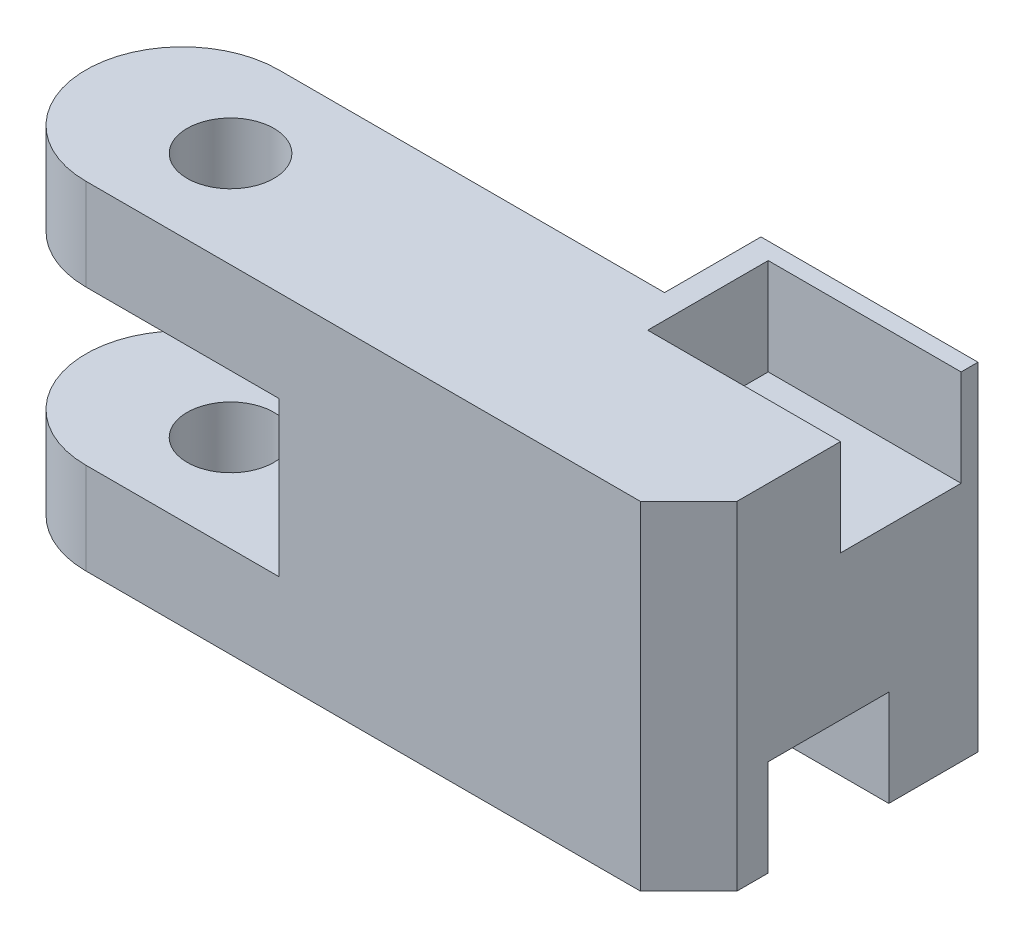
ISO-10303-21;
HEADER;
FILE_DESCRIPTION(('STEP AP214'),'2;1');
FILE_NAME('part.step','',(''),(''),'','','');
FILE_SCHEMA(('AUTOMOTIVE_DESIGN { 1 0 10303 214 1 1 1 1 }'));
ENDSEC;
DATA;
#1=APPLICATION_CONTEXT('core data for automotive mechanical design processes');
#2=APPLICATION_PROTOCOL_DEFINITION('international standard','automotive_design',2000,#1);
#3=PRODUCT_CONTEXT('',#1,'mechanical');
#4=PRODUCT('Part','Part','',(#3));
#5=PRODUCT_RELATED_PRODUCT_CATEGORY('part','',(#4));
#6=PRODUCT_DEFINITION_FORMATION('','',#4);
#7=PRODUCT_DEFINITION_CONTEXT('part definition',#1,'design');
#8=PRODUCT_DEFINITION('design','',#6,#7);
#9=PRODUCT_DEFINITION_SHAPE('','',#8);
#10=(LENGTH_UNIT() NAMED_UNIT(*) SI_UNIT(.MILLI.,.METRE.));
#11=(NAMED_UNIT(*) PLANE_ANGLE_UNIT() SI_UNIT($,.RADIAN.));
#12=(NAMED_UNIT(*) SI_UNIT($,.STERADIAN.) SOLID_ANGLE_UNIT());
#13=UNCERTAINTY_MEASURE_WITH_UNIT(LENGTH_MEASURE(1.E-05),#10,'distance_accuracy_value','');
#14=(GEOMETRIC_REPRESENTATION_CONTEXT(3) GLOBAL_UNCERTAINTY_ASSIGNED_CONTEXT((#13)) GLOBAL_UNIT_ASSIGNED_CONTEXT((#10,
#11,#12)) REPRESENTATION_CONTEXT('',''));
#15=CARTESIAN_POINT('',(0.,0.,0.));
#16=DIRECTION('',(0.,0.,1.));
#17=DIRECTION('',(1.,0.,0.));
#18=AXIS2_PLACEMENT_3D('',#15,#16,#17);
#19=CARTESIAN_POINT('',(-1.,7.,0.));
#20=DIRECTION('',(0.,-1.,0.));
#21=DIRECTION('',(0.,0.,-1.));
#22=AXIS2_PLACEMENT_3D('',#19,#20,#21);
#23=CYLINDRICAL_SURFACE('',#22,2.);
#24=DIRECTION('',(0.,-1.,0.));
#25=VECTOR('',#24,1.);
#26=CARTESIAN_POINT('',(-1.,7.,-2.));
#27=LINE('',#26,#25);
#28=CARTESIAN_POINT('',(-1.,7.,-2.));
#29=VERTEX_POINT('',#28);
#30=CARTESIAN_POINT('',(-0.999999999999999,5.1,-2.));
#31=VERTEX_POINT('',#30);
#32=EDGE_CURVE('E301',#29,#31,#27,.T.);
#33=ORIENTED_EDGE('',*,*,#32,.T.);
#34=CARTESIAN_POINT('',(-1.,5.1,0.));
#35=DIRECTION('',(0.,1.,0.));
#36=DIRECTION('',(-1.,0.,0.));
#37=AXIS2_PLACEMENT_3D('',#34,#35,#36);
#38=CIRCLE('',#37,2.);
#39=CARTESIAN_POINT('',(-1.,5.1,2.));
#40=VERTEX_POINT('',#39);
#41=EDGE_CURVE('E238',#40,#31,#38,.F.);
#42=ORIENTED_EDGE('',*,*,#41,.F.);
#43=DIRECTION('',(0.,-1.,0.));
#44=VECTOR('',#43,1.);
#45=CARTESIAN_POINT('',(-1.,7.,2.));
#46=LINE('',#45,#44);
#47=CARTESIAN_POINT('',(-1.,7.,2.));
#48=VERTEX_POINT('',#47);
#49=EDGE_CURVE('E314',#48,#40,#46,.T.);
#50=ORIENTED_EDGE('',*,*,#49,.F.);
#51=CARTESIAN_POINT('',(-1.,7.,0.));
#52=DIRECTION('',(0.,1.,0.));
#53=DIRECTION('',(0.,0.,1.));
#54=AXIS2_PLACEMENT_3D('',#51,#52,#53);
#55=CIRCLE('',#54,2.);
#56=EDGE_CURVE('E273',#29,#48,#55,.T.);
#57=ORIENTED_EDGE('',*,*,#56,.F.);
#58=EDGE_LOOP('',(#33,#42,#50,#57));
#59=FACE_BOUND('',#58,.T.);
#60=ADVANCED_FACE('F41',(#59),#23,.T.);
#61=CARTESIAN_POINT('',(0.,7.,0.));
#62=DIRECTION('',(0.,-1.,0.));
#63=DIRECTION('',(0.,0.,-1.));
#64=AXIS2_PLACEMENT_3D('',#61,#62,#63);
#65=CYLINDRICAL_SURFACE('',#64,0.9);
#66=CARTESIAN_POINT('',(0.,5.1,0.));
#67=DIRECTION('',(0.,1.,0.));
#68=DIRECTION('',(-1.,0.,0.));
#69=AXIS2_PLACEMENT_3D('',#66,#67,#68);
#70=CIRCLE('',#69,0.9);
#71=CARTESIAN_POINT('',(-0.9,5.1,0.));
#72=VERTEX_POINT('',#71);
#73=EDGE_CURVE('E242',#72,#72,#70,.F.);
#74=ORIENTED_EDGE('',*,*,#73,.T.);
#75=EDGE_LOOP('',(#74));
#76=FACE_BOUND('',#75,.T.);
#77=CARTESIAN_POINT('',(0.,7.,0.));
#78=DIRECTION('',(0.,1.,0.));
#79=DIRECTION('',(0.,0.,1.));
#80=AXIS2_PLACEMENT_3D('',#77,#78,#79);
#81=CIRCLE('',#80,0.9);
#82=CARTESIAN_POINT('',(0.,7.,0.9));
#83=VERTEX_POINT('',#82);
#84=EDGE_CURVE('E267',#83,#83,#81,.T.);
#85=ORIENTED_EDGE('',*,*,#84,.T.);
#86=EDGE_LOOP('',(#85));
#87=FACE_BOUND('',#86,.T.);
#88=ADVANCED_FACE('F379',(#76,#87),#65,.F.);
#89=CARTESIAN_POINT('',(-1.,7.,0.));
#90=DIRECTION('',(0.,1.,0.));
#91=DIRECTION('',(0.,0.,1.));
#92=AXIS2_PLACEMENT_3D('',#89,#90,#91);
#93=PLANE('',#92);
#94=DIRECTION('',(1.,0.,0.));
#95=VECTOR('',#94,1.);
#96=CARTESIAN_POINT('',(-1.,7.,2.));
#97=LINE('',#96,#95);
#98=CARTESIAN_POINT('',(10.5,7.,2.));
#99=VERTEX_POINT('',#98);
#100=EDGE_CURVE('E276',#48,#99,#97,.T.);
#101=ORIENTED_EDGE('',*,*,#100,.T.);
#102=DIRECTION('',(-0.707106781186549,0.,0.707106781186546));
#103=VECTOR('',#102,1.);
#104=CARTESIAN_POINT('',(5.74999999999997,7.,6.75));
#105=LINE('',#104,#103);
#106=CARTESIAN_POINT('',(11.5,7.,1.));
#107=VERTEX_POINT('',#106);
#108=EDGE_CURVE('E11',#99,#107,#105,.F.);
#109=ORIENTED_EDGE('',*,*,#108,.T.);
#110=DIRECTION('',(0.,0.,-1.));
#111=VECTOR('',#110,1.);
#112=CARTESIAN_POINT('',(11.5,7.,-2.));
#113=LINE('',#112,#111);
#114=CARTESIAN_POINT('',(11.5,7.,-1.15));
#115=VERTEX_POINT('',#114);
#116=EDGE_CURVE('E198',#107,#115,#113,.T.);
#117=ORIENTED_EDGE('',*,*,#116,.T.);
#118=DIRECTION('',(1.,0.,0.));
#119=VECTOR('',#118,1.);
#120=CARTESIAN_POINT('',(7.5,7.,-1.15));
#121=LINE('',#120,#119);
#122=CARTESIAN_POINT('',(7.5,7.,-1.15));
#123=VERTEX_POINT('',#122);
#124=EDGE_CURVE('E177',#123,#115,#121,.T.);
#125=ORIENTED_EDGE('',*,*,#124,.F.);
#126=DIRECTION('',(0.,0.,1.));
#127=VECTOR('',#126,1.);
#128=CARTESIAN_POINT('',(7.5,7.,-3.65));
#129=LINE('',#128,#127);
#130=CARTESIAN_POINT('',(7.5,7.,-3.65));
#131=VERTEX_POINT('',#130);
#132=EDGE_CURVE('E184',#131,#123,#129,.T.);
#133=ORIENTED_EDGE('',*,*,#132,.F.);
#134=DIRECTION('',(1.,0.,0.));
#135=VECTOR('',#134,1.);
#136=CARTESIAN_POINT('',(7.5,7.,-3.65));
#137=LINE('',#136,#135);
#138=CARTESIAN_POINT('',(11.5,7.,-3.65));
#139=VERTEX_POINT('',#138);
#140=EDGE_CURVE('E239',#131,#139,#137,.T.);
#141=ORIENTED_EDGE('',*,*,#140,.T.);
#142=CARTESIAN_POINT('',(11.5,7.,-4.));
#143=VERTEX_POINT('',#142);
#144=EDGE_CURVE('E279',#139,#143,#113,.T.);
#145=ORIENTED_EDGE('',*,*,#144,.T.);
#146=DIRECTION('',(-1.,0.,0.));
#147=VECTOR('',#146,1.);
#148=CARTESIAN_POINT('',(11.5,7.,-4.));
#149=LINE('',#148,#147);
#150=CARTESIAN_POINT('',(7.,7.,-4.));
#151=VERTEX_POINT('',#150);
#152=EDGE_CURVE('E281',#143,#151,#149,.T.);
#153=ORIENTED_EDGE('',*,*,#152,.T.);
#154=DIRECTION('',(0.,0.,1.));
#155=VECTOR('',#154,1.);
#156=CARTESIAN_POINT('',(7.,7.,-4.));
#157=LINE('',#156,#155);
#158=CARTESIAN_POINT('',(7.,7.,-2.));
#159=VERTEX_POINT('',#158);
#160=EDGE_CURVE('E283',#151,#159,#157,.T.);
#161=ORIENTED_EDGE('',*,*,#160,.T.);
#162=DIRECTION('',(-1.,0.,0.));
#163=VECTOR('',#162,1.);
#164=CARTESIAN_POINT('',(-1.,7.,-2.));
#165=LINE('',#164,#163);
#166=EDGE_CURVE('E285',#159,#29,#165,.T.);
#167=ORIENTED_EDGE('',*,*,#166,.T.);
#168=ORIENTED_EDGE('',*,*,#56,.T.);
#169=EDGE_LOOP('',(#101,#109,#117,#125,#133,#141,#145,#153,#161,#167,#168));
#170=FACE_BOUND('',#169,.T.);
#171=ORIENTED_EDGE('',*,*,#84,.F.);
#172=EDGE_LOOP('',(#171));
#173=FACE_BOUND('',#172,.T.);
#174=ADVANCED_FACE('F195',(#170,#173),#93,.T.);
#175=CARTESIAN_POINT('',(-1.,0.,0.));
#176=DIRECTION('',(0.,1.,0.));
#177=DIRECTION('',(0.,0.,1.));
#178=AXIS2_PLACEMENT_3D('',#175,#176,#177);
#179=PLANE('',#178);
#180=DIRECTION('',(0.,0.,-1.));
#181=VECTOR('',#180,1.);
#182=CARTESIAN_POINT('',(11.5,0.,-2.));
#183=LINE('',#182,#181);
#184=CARTESIAN_POINT('',(11.5,0.,1.));
#185=VERTEX_POINT('',#184);
#186=CARTESIAN_POINT('',(11.5,0.,0.35));
#187=VERTEX_POINT('',#186);
#188=EDGE_CURVE('E293',#185,#187,#183,.T.);
#189=ORIENTED_EDGE('',*,*,#188,.F.);
#190=DIRECTION('',(0.707106781186549,0.,-0.707106781186546));
#191=VECTOR('',#190,1.);
#192=CARTESIAN_POINT('',(11.5,0.,1.));
#193=LINE('',#192,#191);
#194=CARTESIAN_POINT('',(10.5,0.,2.));
#195=VERTEX_POINT('',#194);
#196=EDGE_CURVE('E64',#185,#195,#193,.F.);
#197=ORIENTED_EDGE('',*,*,#196,.T.);
#198=DIRECTION('',(1.,0.,0.));
#199=VECTOR('',#198,1.);
#200=CARTESIAN_POINT('',(-1.,0.,2.));
#201=LINE('',#200,#199);
#202=CARTESIAN_POINT('',(-1.,0.,2.));
#203=VERTEX_POINT('',#202);
#204=EDGE_CURVE('E290',#203,#195,#201,.T.);
#205=ORIENTED_EDGE('',*,*,#204,.F.);
#206=CARTESIAN_POINT('',(-1.,0.,0.));
#207=DIRECTION('',(0.,1.,0.));
#208=DIRECTION('',(0.,0.,1.));
#209=AXIS2_PLACEMENT_3D('',#206,#207,#208);
#210=CIRCLE('',#209,2.);
#211=CARTESIAN_POINT('',(-1.,0.,-2.));
#212=VERTEX_POINT('',#211);
#213=EDGE_CURVE('E270',#212,#203,#210,.T.);
#214=ORIENTED_EDGE('',*,*,#213,.F.);
#215=DIRECTION('',(-1.,0.,0.));
#216=VECTOR('',#215,1.);
#217=CARTESIAN_POINT('',(-1.,0.,-2.));
#218=LINE('',#217,#216);
#219=CARTESIAN_POINT('',(7.,0.,-2.));
#220=VERTEX_POINT('',#219);
#221=EDGE_CURVE('E277',#220,#212,#218,.T.);
#222=ORIENTED_EDGE('',*,*,#221,.F.);
#223=DIRECTION('',(0.,0.,1.));
#224=VECTOR('',#223,1.);
#225=CARTESIAN_POINT('',(7.,0.,-4.));
#226=LINE('',#225,#224);
#227=CARTESIAN_POINT('',(7.,0.,-4.));
#228=VERTEX_POINT('',#227);
#229=EDGE_CURVE('E297',#228,#220,#226,.T.);
#230=ORIENTED_EDGE('',*,*,#229,.F.);
#231=DIRECTION('',(-1.,0.,0.));
#232=VECTOR('',#231,1.);
#233=CARTESIAN_POINT('',(11.5,0.,-4.));
#234=LINE('',#233,#232);
#235=CARTESIAN_POINT('',(11.5,0.,-4.));
#236=VERTEX_POINT('',#235);
#237=EDGE_CURVE('E295',#236,#228,#234,.T.);
#238=ORIENTED_EDGE('',*,*,#237,.F.);
#239=CARTESIAN_POINT('',(11.5,0.,-2.15));
#240=VERTEX_POINT('',#239);
#241=EDGE_CURVE('E292',#240,#236,#183,.T.);
#242=ORIENTED_EDGE('',*,*,#241,.F.);
#243=DIRECTION('',(1.,0.,0.));
#244=VECTOR('',#243,1.);
#245=CARTESIAN_POINT('',(7.5,0.,-2.15));
#246=LINE('',#245,#244);
#247=CARTESIAN_POINT('',(7.5,0.,-2.15));
#248=VERTEX_POINT('',#247);
#249=EDGE_CURVE('E209',#248,#240,#246,.T.);
#250=ORIENTED_EDGE('',*,*,#249,.F.);
#251=DIRECTION('',(0.,0.,-1.));
#252=VECTOR('',#251,1.);
#253=CARTESIAN_POINT('',(7.5,0.,0.35));
#254=LINE('',#253,#252);
#255=CARTESIAN_POINT('',(7.5,0.,0.35));
#256=VERTEX_POINT('',#255);
#257=EDGE_CURVE('E231',#256,#248,#254,.T.);
#258=ORIENTED_EDGE('',*,*,#257,.F.);
#259=DIRECTION('',(1.,0.,0.));
#260=VECTOR('',#259,1.);
#261=CARTESIAN_POINT('',(7.5,0.,0.35));
#262=LINE('',#261,#260);
#263=EDGE_CURVE('E205',#256,#187,#262,.T.);
#264=ORIENTED_EDGE('',*,*,#263,.T.);
#265=EDGE_LOOP('',(#189,#197,#205,#214,#222,#230,#238,#242,#250,#258,#264));
#266=FACE_BOUND('',#265,.T.);
#267=CARTESIAN_POINT('',(0.,0.,0.));
#268=DIRECTION('',(0.,1.,0.));
#269=DIRECTION('',(0.,0.,1.));
#270=AXIS2_PLACEMENT_3D('',#267,#268,#269);
#271=CIRCLE('',#270,0.9);
#272=CARTESIAN_POINT('',(0.,0.,0.9));
#273=VERTEX_POINT('',#272);
#274=EDGE_CURVE('E266',#273,#273,#271,.T.);
#275=ORIENTED_EDGE('',*,*,#274,.T.);
#276=EDGE_LOOP('',(#275));
#277=FACE_BOUND('',#276,.T.);
#278=ADVANCED_FACE('F326',(#266,#277),#179,.F.);
#279=CARTESIAN_POINT('',(-1.,1.9,2.));
#280=VERTEX_POINT('',#279);
#281=EDGE_CURVE('E313',#280,#203,#46,.T.);
#282=ORIENTED_EDGE('',*,*,#281,.F.);
#283=CARTESIAN_POINT('',(-1.,1.9,0.));
#284=DIRECTION('',(0.,-1.,0.));
#285=DIRECTION('',(1.,0.,0.));
#286=AXIS2_PLACEMENT_3D('',#283,#284,#285);
#287=CIRCLE('',#286,2.);
#288=CARTESIAN_POINT('',(-0.999999999999999,1.9,-2.));
#289=VERTEX_POINT('',#288);
#290=EDGE_CURVE('E236',#289,#280,#287,.F.);
#291=ORIENTED_EDGE('',*,*,#290,.F.);
#292=EDGE_CURVE('E287',#289,#212,#27,.T.);
#293=ORIENTED_EDGE('',*,*,#292,.T.);
#294=ORIENTED_EDGE('',*,*,#213,.T.);
#295=EDGE_LOOP('',(#282,#291,#293,#294));
#296=FACE_BOUND('',#295,.T.);
#297=ADVANCED_FACE('F381',(#296),#23,.T.);
#298=CARTESIAN_POINT('',(-1.,7.,2.));
#299=DIRECTION('',(0.,0.,-1.));
#300=DIRECTION('',(-1.,0.,0.));
#301=AXIS2_PLACEMENT_3D('',#298,#299,#300);
#302=PLANE('',#301);
#303=ORIENTED_EDGE('',*,*,#204,.T.);
#304=DIRECTION('',(0.,1.,0.));
#305=VECTOR('',#304,1.);
#306=CARTESIAN_POINT('',(10.5,7.,2.));
#307=LINE('',#306,#305);
#308=EDGE_CURVE('E50',#195,#99,#307,.T.);
#309=ORIENTED_EDGE('',*,*,#308,.T.);
#310=ORIENTED_EDGE('',*,*,#100,.F.);
#311=ORIENTED_EDGE('',*,*,#49,.T.);
#312=DIRECTION('',(-1.,0.,0.));
#313=VECTOR('',#312,1.);
#314=CARTESIAN_POINT('',(-3.,5.1,2.));
#315=LINE('',#314,#313);
#316=CARTESIAN_POINT('',(3.,5.1,2.));
#317=VERTEX_POINT('',#316);
#318=EDGE_CURVE('E256',#317,#40,#315,.T.);
#319=ORIENTED_EDGE('',*,*,#318,.F.);
#320=DIRECTION('',(0.,1.,0.));
#321=VECTOR('',#320,1.);
#322=CARTESIAN_POINT('',(3.,5.1,2.));
#323=LINE('',#322,#321);
#324=CARTESIAN_POINT('',(3.,1.9,2.));
#325=VERTEX_POINT('',#324);
#326=EDGE_CURVE('E253',#325,#317,#323,.T.);
#327=ORIENTED_EDGE('',*,*,#326,.F.);
#328=DIRECTION('',(1.,0.,0.));
#329=VECTOR('',#328,1.);
#330=CARTESIAN_POINT('',(-3.,1.9,2.));
#331=LINE('',#330,#329);
#332=EDGE_CURVE('E250',#280,#325,#331,.T.);
#333=ORIENTED_EDGE('',*,*,#332,.F.);
#334=ORIENTED_EDGE('',*,*,#281,.T.);
#335=EDGE_LOOP('',(#303,#309,#310,#311,#319,#327,#333,#334));
#336=FACE_BOUND('',#335,.T.);
#337=ADVANCED_FACE('F391',(#336),#302,.F.);
#338=CARTESIAN_POINT('',(11.5,7.,-2.));
#339=DIRECTION('',(-1.,0.,0.));
#340=DIRECTION('',(0.,0.,1.));
#341=AXIS2_PLACEMENT_3D('',#338,#339,#340);
#342=PLANE('',#341);
#343=ORIENTED_EDGE('',*,*,#116,.F.);
#344=DIRECTION('',(0.,-1.,0.));
#345=VECTOR('',#344,1.);
#346=CARTESIAN_POINT('',(11.5,7.,1.));
#347=LINE('',#346,#345);
#348=EDGE_CURVE('E317',#107,#185,#347,.T.);
#349=ORIENTED_EDGE('',*,*,#348,.T.);
#350=ORIENTED_EDGE('',*,*,#188,.T.);
#351=DIRECTION('',(0.,-1.,0.));
#352=VECTOR('',#351,1.);
#353=CARTESIAN_POINT('',(11.5,2.,0.35));
#354=LINE('',#353,#352);
#355=CARTESIAN_POINT('',(11.5,2.,0.35));
#356=VERTEX_POINT('',#355);
#357=EDGE_CURVE('E222',#356,#187,#354,.T.);
#358=ORIENTED_EDGE('',*,*,#357,.F.);
#359=DIRECTION('',(0.,0.,1.));
#360=VECTOR('',#359,1.);
#361=CARTESIAN_POINT('',(11.5,2.,0.35));
#362=LINE('',#361,#360);
#363=CARTESIAN_POINT('',(11.5,2.,-2.15));
#364=VERTEX_POINT('',#363);
#365=EDGE_CURVE('E215',#364,#356,#362,.T.);
#366=ORIENTED_EDGE('',*,*,#365,.F.);
#367=DIRECTION('',(0.,1.,0.));
#368=VECTOR('',#367,1.);
#369=CARTESIAN_POINT('',(11.5,2.,-2.15));
#370=LINE('',#369,#368);
#371=EDGE_CURVE('E218',#240,#364,#370,.T.);
#372=ORIENTED_EDGE('',*,*,#371,.F.);
#373=ORIENTED_EDGE('',*,*,#241,.T.);
#374=DIRECTION('',(0.,-1.,0.));
#375=VECTOR('',#374,1.);
#376=CARTESIAN_POINT('',(11.5,7.,-4.));
#377=LINE('',#376,#375);
#378=EDGE_CURVE('E310',#143,#236,#377,.T.);
#379=ORIENTED_EDGE('',*,*,#378,.F.);
#380=ORIENTED_EDGE('',*,*,#144,.F.);
#381=DIRECTION('',(0.,1.,0.));
#382=VECTOR('',#381,1.);
#383=CARTESIAN_POINT('',(11.5,5.,-3.65));
#384=LINE('',#383,#382);
#385=CARTESIAN_POINT('',(11.5,5.,-3.65));
#386=VERTEX_POINT('',#385);
#387=EDGE_CURVE('E193',#386,#139,#384,.T.);
#388=ORIENTED_EDGE('',*,*,#387,.F.);
#389=DIRECTION('',(0.,0.,-1.));
#390=VECTOR('',#389,1.);
#391=CARTESIAN_POINT('',(11.5,5.,-1.15));
#392=LINE('',#391,#390);
#393=CARTESIAN_POINT('',(11.5,5.,-1.15));
#394=VERTEX_POINT('',#393);
#395=EDGE_CURVE('E360',#394,#386,#392,.T.);
#396=ORIENTED_EDGE('',*,*,#395,.F.);
#397=DIRECTION('',(0.,-1.,0.));
#398=VECTOR('',#397,1.);
#399=CARTESIAN_POINT('',(11.5,7.,-1.15));
#400=LINE('',#399,#398);
#401=EDGE_CURVE('E225',#115,#394,#400,.T.);
#402=ORIENTED_EDGE('',*,*,#401,.F.);
#403=EDGE_LOOP('',(#343,#349,#350,#358,#366,#372,#373,#379,#380,#388,#396,#402));
#404=FACE_BOUND('',#403,.T.);
#405=ADVANCED_FACE('F322',(#404),#342,.F.);
#406=CARTESIAN_POINT('',(11.5,7.,-4.));
#407=DIRECTION('',(0.,0.,1.));
#408=DIRECTION('',(1.,0.,0.));
#409=AXIS2_PLACEMENT_3D('',#406,#407,#408);
#410=PLANE('',#409);
#411=ORIENTED_EDGE('',*,*,#237,.T.);
#412=DIRECTION('',(0.,-1.,0.));
#413=VECTOR('',#412,1.);
#414=CARTESIAN_POINT('',(7.,7.,-4.));
#415=LINE('',#414,#413);
#416=EDGE_CURVE('E307',#151,#228,#415,.T.);
#417=ORIENTED_EDGE('',*,*,#416,.F.);
#418=ORIENTED_EDGE('',*,*,#152,.F.);
#419=ORIENTED_EDGE('',*,*,#378,.T.);
#420=EDGE_LOOP('',(#411,#417,#418,#419));
#421=FACE_BOUND('',#420,.T.);
#422=ADVANCED_FACE('F348',(#421),#410,.F.);
#423=CARTESIAN_POINT('',(7.,7.,-4.));
#424=DIRECTION('',(1.,0.,0.));
#425=DIRECTION('',(0.,0.,-1.));
#426=AXIS2_PLACEMENT_3D('',#423,#424,#425);
#427=PLANE('',#426);
#428=ORIENTED_EDGE('',*,*,#229,.T.);
#429=DIRECTION('',(0.,-1.,0.));
#430=VECTOR('',#429,1.);
#431=CARTESIAN_POINT('',(7.,7.,-2.));
#432=LINE('',#431,#430);
#433=EDGE_CURVE('E304',#159,#220,#432,.T.);
#434=ORIENTED_EDGE('',*,*,#433,.F.);
#435=ORIENTED_EDGE('',*,*,#160,.F.);
#436=ORIENTED_EDGE('',*,*,#416,.T.);
#437=EDGE_LOOP('',(#428,#434,#435,#436));
#438=FACE_BOUND('',#437,.T.);
#439=ADVANCED_FACE('F352',(#438),#427,.F.);
#440=CARTESIAN_POINT('',(-1.,7.,-2.));
#441=DIRECTION('',(0.,0.,1.));
#442=DIRECTION('',(1.,0.,0.));
#443=AXIS2_PLACEMENT_3D('',#440,#441,#442);
#444=PLANE('',#443);
#445=DIRECTION('',(0.,-1.,0.));
#446=VECTOR('',#445,1.);
#447=CARTESIAN_POINT('',(3.,5.1,-2.));
#448=LINE('',#447,#446);
#449=CARTESIAN_POINT('',(3.,5.1,-2.));
#450=VERTEX_POINT('',#449);
#451=CARTESIAN_POINT('',(3.,1.9,-2.));
#452=VERTEX_POINT('',#451);
#453=EDGE_CURVE('E245',#450,#452,#448,.T.);
#454=ORIENTED_EDGE('',*,*,#453,.F.);
#455=DIRECTION('',(1.,0.,0.));
#456=VECTOR('',#455,1.);
#457=CARTESIAN_POINT('',(-3.,5.1,-2.));
#458=LINE('',#457,#456);
#459=EDGE_CURVE('E247',#31,#450,#458,.T.);
#460=ORIENTED_EDGE('',*,*,#459,.F.);
#461=ORIENTED_EDGE('',*,*,#32,.F.);
#462=ORIENTED_EDGE('',*,*,#166,.F.);
#463=ORIENTED_EDGE('',*,*,#433,.T.);
#464=ORIENTED_EDGE('',*,*,#221,.T.);
#465=ORIENTED_EDGE('',*,*,#292,.F.);
#466=DIRECTION('',(-1.,0.,0.));
#467=VECTOR('',#466,1.);
#468=CARTESIAN_POINT('',(-3.,1.9,-2.));
#469=LINE('',#468,#467);
#470=EDGE_CURVE('E261',#452,#289,#469,.T.);
#471=ORIENTED_EDGE('',*,*,#470,.F.);
#472=EDGE_LOOP('',(#454,#460,#461,#462,#463,#464,#465,#471));
#473=FACE_BOUND('',#472,.T.);
#474=ADVANCED_FACE('F407',(#473),#444,.F.);
#475=CARTESIAN_POINT('',(0.,1.9,0.));
#476=DIRECTION('',(0.,-1.,0.));
#477=DIRECTION('',(1.,0.,0.));
#478=AXIS2_PLACEMENT_3D('',#475,#476,#477);
#479=CIRCLE('',#478,0.9);
#480=CARTESIAN_POINT('',(0.9,1.9,0.));
#481=VERTEX_POINT('',#480);
#482=EDGE_CURVE('E241',#481,#481,#479,.F.);
#483=ORIENTED_EDGE('',*,*,#482,.T.);
#484=EDGE_LOOP('',(#483));
#485=FACE_BOUND('',#484,.T.);
#486=ORIENTED_EDGE('',*,*,#274,.F.);
#487=EDGE_LOOP('',(#486));
#488=FACE_BOUND('',#487,.T.);
#489=ADVANCED_FACE('F388',(#485,#488),#65,.F.);
#490=CARTESIAN_POINT('',(-3.,5.1,-4.001));
#491=DIRECTION('',(0.,1.,0.));
#492=DIRECTION('',(-1.,0.,0.));
#493=AXIS2_PLACEMENT_3D('',#490,#491,#492);
#494=PLANE('',#493);
#495=ORIENTED_EDGE('',*,*,#73,.F.);
#496=EDGE_LOOP('',(#495));
#497=FACE_BOUND('',#496,.T.);
#498=ORIENTED_EDGE('',*,*,#41,.T.);
#499=ORIENTED_EDGE('',*,*,#459,.T.);
#500=DIRECTION('',(0.,0.,1.));
#501=VECTOR('',#500,1.);
#502=CARTESIAN_POINT('',(3.,5.1,-4.001));
#503=LINE('',#502,#501);
#504=EDGE_CURVE('E259',#450,#317,#503,.T.);
#505=ORIENTED_EDGE('',*,*,#504,.T.);
#506=ORIENTED_EDGE('',*,*,#318,.T.);
#507=EDGE_LOOP('',(#498,#499,#505,#506));
#508=FACE_BOUND('',#507,.T.);
#509=ADVANCED_FACE('F480',(#497,#508),#494,.F.);
#510=CARTESIAN_POINT('',(3.,5.1,-4.001));
#511=DIRECTION('',(1.,0.,0.));
#512=DIRECTION('',(0.,0.,-1.));
#513=AXIS2_PLACEMENT_3D('',#510,#511,#512);
#514=PLANE('',#513);
#515=ORIENTED_EDGE('',*,*,#453,.T.);
#516=DIRECTION('',(0.,0.,1.));
#517=VECTOR('',#516,1.);
#518=CARTESIAN_POINT('',(3.,1.9,-4.001));
#519=LINE('',#518,#517);
#520=EDGE_CURVE('E258',#452,#325,#519,.T.);
#521=ORIENTED_EDGE('',*,*,#520,.T.);
#522=ORIENTED_EDGE('',*,*,#326,.T.);
#523=ORIENTED_EDGE('',*,*,#504,.F.);
#524=EDGE_LOOP('',(#515,#521,#522,#523));
#525=FACE_BOUND('',#524,.T.);
#526=ADVANCED_FACE('F498',(#525),#514,.F.);
#527=CARTESIAN_POINT('',(-3.,1.9,-4.001));
#528=DIRECTION('',(0.,-1.,0.));
#529=DIRECTION('',(1.,0.,0.));
#530=AXIS2_PLACEMENT_3D('',#527,#528,#529);
#531=PLANE('',#530);
#532=ORIENTED_EDGE('',*,*,#482,.F.);
#533=EDGE_LOOP('',(#532));
#534=FACE_BOUND('',#533,.T.);
#535=ORIENTED_EDGE('',*,*,#290,.T.);
#536=ORIENTED_EDGE('',*,*,#332,.T.);
#537=ORIENTED_EDGE('',*,*,#520,.F.);
#538=ORIENTED_EDGE('',*,*,#470,.T.);
#539=EDGE_LOOP('',(#535,#536,#537,#538));
#540=FACE_BOUND('',#539,.T.);
#541=ADVANCED_FACE('F508',(#534,#540),#531,.F.);
#542=CARTESIAN_POINT('',(7.5,2.,0.35));
#543=DIRECTION('',(0.,0.,1.));
#544=DIRECTION('',(1.,0.,0.));
#545=AXIS2_PLACEMENT_3D('',#542,#543,#544);
#546=PLANE('',#545);
#547=ORIENTED_EDGE('',*,*,#357,.T.);
#548=ORIENTED_EDGE('',*,*,#263,.F.);
#549=DIRECTION('',(0.,-1.,0.));
#550=VECTOR('',#549,1.);
#551=CARTESIAN_POINT('',(7.5,2.,0.35));
#552=LINE('',#551,#550);
#553=CARTESIAN_POINT('',(7.5,2.,0.35));
#554=VERTEX_POINT('',#553);
#555=EDGE_CURVE('E219',#554,#256,#552,.T.);
#556=ORIENTED_EDGE('',*,*,#555,.F.);
#557=DIRECTION('',(1.,0.,0.));
#558=VECTOR('',#557,1.);
#559=CARTESIAN_POINT('',(7.5,2.,0.35));
#560=LINE('',#559,#558);
#561=EDGE_CURVE('E213',#554,#356,#560,.T.);
#562=ORIENTED_EDGE('',*,*,#561,.T.);
#563=EDGE_LOOP('',(#547,#548,#556,#562));
#564=FACE_BOUND('',#563,.T.);
#565=ADVANCED_FACE('F332',(#564),#546,.F.);
#566=CARTESIAN_POINT('',(7.5,2.,0.35));
#567=DIRECTION('',(0.,1.,0.));
#568=DIRECTION('',(0.,0.,1.));
#569=AXIS2_PLACEMENT_3D('',#566,#567,#568);
#570=PLANE('',#569);
#571=ORIENTED_EDGE('',*,*,#365,.T.);
#572=ORIENTED_EDGE('',*,*,#561,.F.);
#573=DIRECTION('',(0.,0.,1.));
#574=VECTOR('',#573,1.);
#575=CARTESIAN_POINT('',(7.5,2.,0.35));
#576=LINE('',#575,#574);
#577=CARTESIAN_POINT('',(7.5,2.,-2.15));
#578=VERTEX_POINT('',#577);
#579=EDGE_CURVE('E208',#578,#554,#576,.T.);
#580=ORIENTED_EDGE('',*,*,#579,.F.);
#581=DIRECTION('',(1.,0.,0.));
#582=VECTOR('',#581,1.);
#583=CARTESIAN_POINT('',(7.5,2.,-2.15));
#584=LINE('',#583,#582);
#585=EDGE_CURVE('E211',#578,#364,#584,.T.);
#586=ORIENTED_EDGE('',*,*,#585,.T.);
#587=EDGE_LOOP('',(#571,#572,#580,#586));
#588=FACE_BOUND('',#587,.T.);
#589=ADVANCED_FACE('F337',(#588),#570,.F.);
#590=CARTESIAN_POINT('',(7.5,2.,-2.15));
#591=DIRECTION('',(0.,0.,-1.));
#592=DIRECTION('',(0.,1.,0.));
#593=AXIS2_PLACEMENT_3D('',#590,#591,#592);
#594=PLANE('',#593);
#595=ORIENTED_EDGE('',*,*,#371,.T.);
#596=ORIENTED_EDGE('',*,*,#585,.F.);
#597=DIRECTION('',(0.,1.,0.));
#598=VECTOR('',#597,1.);
#599=CARTESIAN_POINT('',(7.5,2.,-2.15));
#600=LINE('',#599,#598);
#601=EDGE_CURVE('E228',#248,#578,#600,.T.);
#602=ORIENTED_EDGE('',*,*,#601,.F.);
#603=ORIENTED_EDGE('',*,*,#249,.T.);
#604=EDGE_LOOP('',(#595,#596,#602,#603));
#605=FACE_BOUND('',#604,.T.);
#606=ADVANCED_FACE('F535',(#605),#594,.F.);
#607=CARTESIAN_POINT('',(7.5,0.,0.));
#608=DIRECTION('',(1.,0.,0.));
#609=DIRECTION('',(0.,0.,-1.));
#610=AXIS2_PLACEMENT_3D('',#607,#608,#609);
#611=PLANE('',#610);
#612=ORIENTED_EDGE('',*,*,#555,.T.);
#613=ORIENTED_EDGE('',*,*,#257,.T.);
#614=ORIENTED_EDGE('',*,*,#601,.T.);
#615=ORIENTED_EDGE('',*,*,#579,.T.);
#616=EDGE_LOOP('',(#612,#613,#614,#615));
#617=FACE_BOUND('',#616,.T.);
#618=ADVANCED_FACE('F334',(#617),#611,.T.);
#619=CARTESIAN_POINT('',(7.5,5.,-3.65));
#620=DIRECTION('',(0.,0.,-1.));
#621=DIRECTION('',(0.,1.,0.));
#622=AXIS2_PLACEMENT_3D('',#619,#620,#621);
#623=PLANE('',#622);
#624=ORIENTED_EDGE('',*,*,#387,.T.);
#625=ORIENTED_EDGE('',*,*,#140,.F.);
#626=DIRECTION('',(0.,1.,0.));
#627=VECTOR('',#626,1.);
#628=CARTESIAN_POINT('',(7.5,5.,-3.65));
#629=LINE('',#628,#627);
#630=CARTESIAN_POINT('',(7.5,5.,-3.65));
#631=VERTEX_POINT('',#630);
#632=EDGE_CURVE('E190',#631,#131,#629,.T.);
#633=ORIENTED_EDGE('',*,*,#632,.F.);
#634=DIRECTION('',(1.,0.,0.));
#635=VECTOR('',#634,1.);
#636=CARTESIAN_POINT('',(7.5,5.,-3.65));
#637=LINE('',#636,#635);
#638=EDGE_CURVE('E200',#631,#386,#637,.T.);
#639=ORIENTED_EDGE('',*,*,#638,.T.);
#640=EDGE_LOOP('',(#624,#625,#633,#639));
#641=FACE_BOUND('',#640,.T.);
#642=ADVANCED_FACE('F366',(#641),#623,.F.);
#643=CARTESIAN_POINT('',(7.5,5.,-1.15));
#644=DIRECTION('',(0.,-1.,0.));
#645=DIRECTION('',(0.,0.,-1.));
#646=AXIS2_PLACEMENT_3D('',#643,#644,#645);
#647=PLANE('',#646);
#648=ORIENTED_EDGE('',*,*,#395,.T.);
#649=ORIENTED_EDGE('',*,*,#638,.F.);
#650=DIRECTION('',(0.,0.,-1.));
#651=VECTOR('',#650,1.);
#652=CARTESIAN_POINT('',(7.5,5.,-1.15));
#653=LINE('',#652,#651);
#654=CARTESIAN_POINT('',(7.5,5.,-1.15));
#655=VERTEX_POINT('',#654);
#656=EDGE_CURVE('E183',#655,#631,#653,.T.);
#657=ORIENTED_EDGE('',*,*,#656,.F.);
#658=DIRECTION('',(1.,0.,0.));
#659=VECTOR('',#658,1.);
#660=CARTESIAN_POINT('',(7.5,5.,-1.15));
#661=LINE('',#660,#659);
#662=EDGE_CURVE('E179',#655,#394,#661,.T.);
#663=ORIENTED_EDGE('',*,*,#662,.T.);
#664=EDGE_LOOP('',(#648,#649,#657,#663));
#665=FACE_BOUND('',#664,.T.);
#666=ADVANCED_FACE('F368',(#665),#647,.F.);
#667=CARTESIAN_POINT('',(7.5,7.,-1.15));
#668=DIRECTION('',(0.,0.,1.));
#669=DIRECTION('',(0.,-1.,0.));
#670=AXIS2_PLACEMENT_3D('',#667,#668,#669);
#671=PLANE('',#670);
#672=ORIENTED_EDGE('',*,*,#401,.T.);
#673=ORIENTED_EDGE('',*,*,#662,.F.);
#674=DIRECTION('',(0.,-1.,0.));
#675=VECTOR('',#674,1.);
#676=CARTESIAN_POINT('',(7.5,7.,-1.15));
#677=LINE('',#676,#675);
#678=EDGE_CURVE('E172',#123,#655,#677,.T.);
#679=ORIENTED_EDGE('',*,*,#678,.F.);
#680=ORIENTED_EDGE('',*,*,#124,.T.);
#681=EDGE_LOOP('',(#672,#673,#679,#680));
#682=FACE_BOUND('',#681,.T.);
#683=ADVANCED_FACE('F175',(#682),#671,.F.);
#684=CARTESIAN_POINT('',(7.5,0.,0.));
#685=DIRECTION('',(1.,0.,0.));
#686=DIRECTION('',(0.,0.,-1.));
#687=AXIS2_PLACEMENT_3D('',#684,#685,#686);
#688=PLANE('',#687);
#689=ORIENTED_EDGE('',*,*,#132,.T.);
#690=ORIENTED_EDGE('',*,*,#678,.T.);
#691=ORIENTED_EDGE('',*,*,#656,.T.);
#692=ORIENTED_EDGE('',*,*,#632,.T.);
#693=EDGE_LOOP('',(#689,#690,#691,#692));
#694=FACE_BOUND('',#693,.T.);
#695=ADVANCED_FACE('F188',(#694),#688,.T.);
#696=CARTESIAN_POINT('',(11.5,7.,1.));
#697=DIRECTION('',(-0.707106781186546,0.,-0.707106781186549));
#698=DIRECTION('',(0.,-1.,0.));
#699=AXIS2_PLACEMENT_3D('',#696,#697,#698);
#700=PLANE('',#699);
#701=ORIENTED_EDGE('',*,*,#108,.F.);
#702=ORIENTED_EDGE('',*,*,#308,.F.);
#703=ORIENTED_EDGE('',*,*,#196,.F.);
#704=ORIENTED_EDGE('',*,*,#348,.F.);
#705=EDGE_LOOP('',(#701,#702,#703,#704));
#706=FACE_BOUND('',#705,.T.);
#707=ADVANCED_FACE('F44',(#706),#700,.F.);
#708=CLOSED_SHELL('',(#60,#88,#174,#278,#297,#337,#405,#422,#439,#474,#489,#509,#526,#541,#565,
#589,#606,#618,#642,#666,#683,#695,#707));
#709=MANIFOLD_SOLID_BREP('B2',#708);
#710=ADVANCED_BREP_SHAPE_REPRESENTATION('',(#18,#709),#14);
#711=SHAPE_DEFINITION_REPRESENTATION(#9,#710);
ENDSEC;
END-ISO-10303-21;
